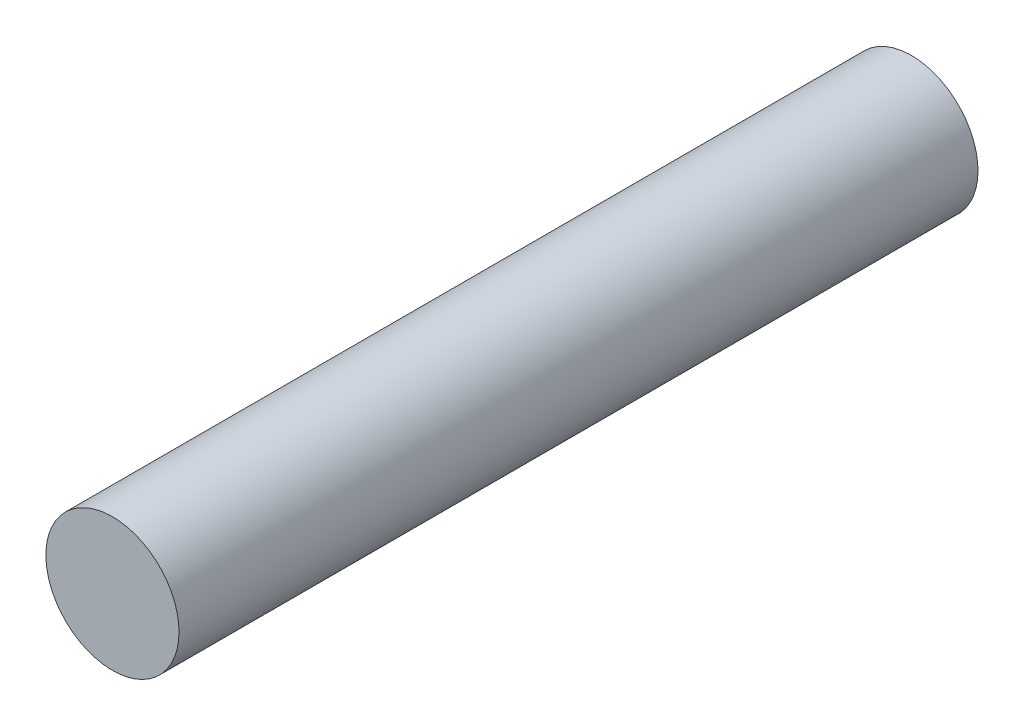
ISO-10303-21;
HEADER;
FILE_DESCRIPTION(('STEP AP214'),'2;1');
FILE_NAME('part.step','',(''),(''),'','','');
FILE_SCHEMA(('AUTOMOTIVE_DESIGN { 1 0 10303 214 1 1 1 1 }'));
ENDSEC;
DATA;
#1=APPLICATION_CONTEXT('core data for automotive mechanical design processes');
#2=APPLICATION_PROTOCOL_DEFINITION('international standard','automotive_design',2000,#1);
#3=PRODUCT_CONTEXT('',#1,'mechanical');
#4=PRODUCT('Part','Part','',(#3));
#5=PRODUCT_RELATED_PRODUCT_CATEGORY('part','',(#4));
#6=PRODUCT_DEFINITION_FORMATION('','',#4);
#7=PRODUCT_DEFINITION_CONTEXT('part definition',#1,'design');
#8=PRODUCT_DEFINITION('design','',#6,#7);
#9=PRODUCT_DEFINITION_SHAPE('','',#8);
#10=(LENGTH_UNIT() NAMED_UNIT(*) SI_UNIT(.MILLI.,.METRE.));
#11=(NAMED_UNIT(*) PLANE_ANGLE_UNIT() SI_UNIT($,.RADIAN.));
#12=(NAMED_UNIT(*) SI_UNIT($,.STERADIAN.) SOLID_ANGLE_UNIT());
#13=UNCERTAINTY_MEASURE_WITH_UNIT(LENGTH_MEASURE(1.E-05),#10,'distance_accuracy_value','');
#14=(GEOMETRIC_REPRESENTATION_CONTEXT(3) GLOBAL_UNCERTAINTY_ASSIGNED_CONTEXT((#13)) GLOBAL_UNIT_ASSIGNED_CONTEXT((#10,
#11,#12)) REPRESENTATION_CONTEXT('',''));
#15=CARTESIAN_POINT('',(0.,0.,0.));
#16=DIRECTION('',(0.,0.,1.));
#17=DIRECTION('',(1.,0.,0.));
#18=AXIS2_PLACEMENT_3D('',#15,#16,#17);
#19=CARTESIAN_POINT('',(0.,0.,13.));
#20=DIRECTION('',(0.,0.,-1.));
#21=DIRECTION('',(-1.,0.,0.));
#22=AXIS2_PLACEMENT_3D('',#19,#20,#21);
#23=CYLINDRICAL_SURFACE('',#22,1.);
#24=CARTESIAN_POINT('',(0.,0.,0.));
#25=DIRECTION('',(0.,0.,1.));
#26=DIRECTION('',(1.,0.,0.));
#27=AXIS2_PLACEMENT_3D('',#24,#25,#26);
#28=CIRCLE('',#27,1.);
#29=CARTESIAN_POINT('',(1.,0.,0.));
#30=VERTEX_POINT('',#29);
#31=EDGE_CURVE('E10',#30,#30,#28,.T.);
#32=ORIENTED_EDGE('',*,*,#31,.T.);
#33=EDGE_LOOP('',(#32));
#34=FACE_BOUND('',#33,.T.);
#35=CARTESIAN_POINT('',(0.,0.,12.));
#36=DIRECTION('',(0.,0.,1.));
#37=DIRECTION('',(1.,0.,0.));
#38=AXIS2_PLACEMENT_3D('',#35,#36,#37);
#39=CIRCLE('',#38,1.);
#40=CARTESIAN_POINT('',(1.,0.,12.));
#41=VERTEX_POINT('',#40);
#42=EDGE_CURVE('E37',#41,#41,#39,.T.);
#43=ORIENTED_EDGE('',*,*,#42,.F.);
#44=EDGE_LOOP('',(#43));
#45=FACE_BOUND('',#44,.T.);
#46=ADVANCED_FACE('F31',(#34,#45),#23,.T.);
#47=CARTESIAN_POINT('',(0.,0.,0.));
#48=DIRECTION('',(0.,0.,1.));
#49=DIRECTION('',(1.,0.,0.));
#50=AXIS2_PLACEMENT_3D('',#47,#48,#49);
#51=PLANE('',#50);
#52=ORIENTED_EDGE('',*,*,#31,.F.);
#53=EDGE_LOOP('',(#52));
#54=FACE_BOUND('',#53,.T.);
#55=ADVANCED_FACE('F46',(#54),#51,.F.);
#56=CARTESIAN_POINT('',(0.,0.,12.));
#57=DIRECTION('',(0.,0.,1.));
#58=DIRECTION('',(1.,0.,0.));
#59=AXIS2_PLACEMENT_3D('',#56,#57,#58);
#60=PLANE('',#59);
#61=ORIENTED_EDGE('',*,*,#42,.T.);
#62=EDGE_LOOP('',(#61));
#63=FACE_BOUND('',#62,.T.);
#64=ADVANCED_FACE('F43',(#63),#60,.T.);
#65=CLOSED_SHELL('',(#46,#55,#64));
#66=MANIFOLD_SOLID_BREP('B2',#65);
#67=ADVANCED_BREP_SHAPE_REPRESENTATION('',(#18,#66),#14);
#68=SHAPE_DEFINITION_REPRESENTATION(#9,#67);
ENDSEC;
END-ISO-10303-21;
